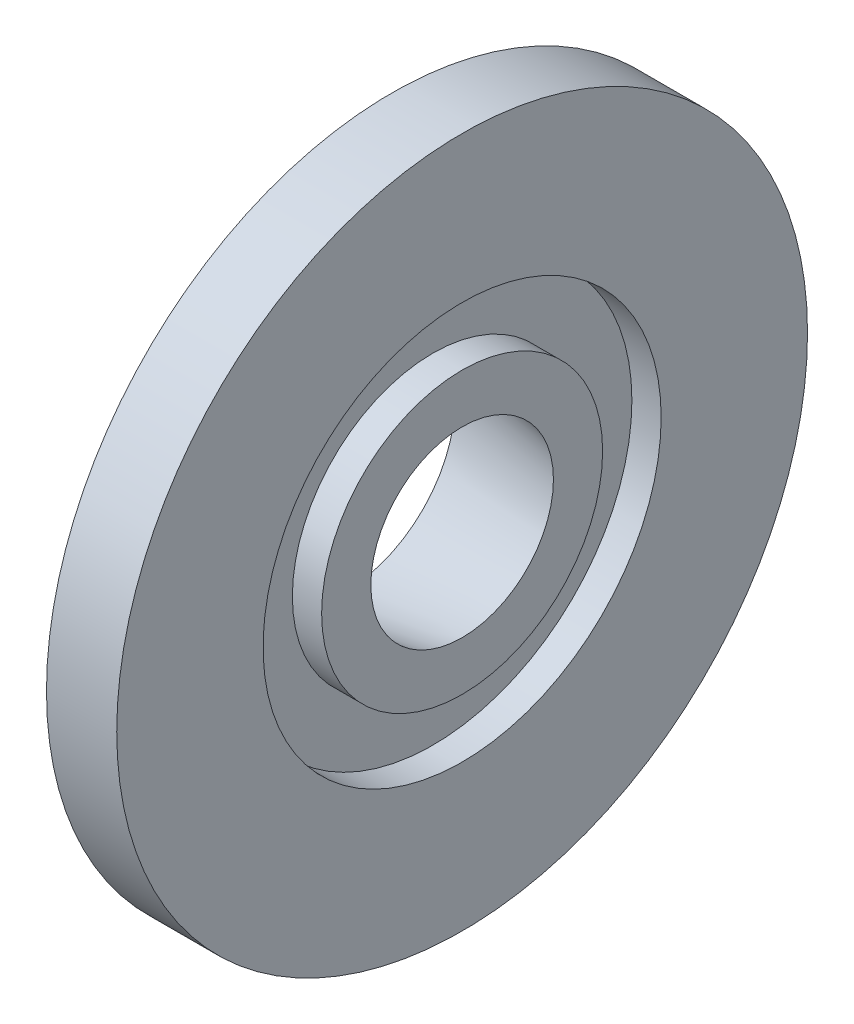
ISO-10303-21;
HEADER;
FILE_DESCRIPTION(('STEP AP214'),'2;1');
FILE_NAME('part.step','',(''),(''),'','','');
FILE_SCHEMA(('AUTOMOTIVE_DESIGN { 1 0 10303 214 1 1 1 1 }'));
ENDSEC;
DATA;
#1=APPLICATION_CONTEXT('core data for automotive mechanical design processes');
#2=APPLICATION_PROTOCOL_DEFINITION('international standard','automotive_design',2000,#1);
#3=PRODUCT_CONTEXT('',#1,'mechanical');
#4=PRODUCT('Part','Part','',(#3));
#5=PRODUCT_RELATED_PRODUCT_CATEGORY('part','',(#4));
#6=PRODUCT_DEFINITION_FORMATION('','',#4);
#7=PRODUCT_DEFINITION_CONTEXT('part definition',#1,'design');
#8=PRODUCT_DEFINITION('design','',#6,#7);
#9=PRODUCT_DEFINITION_SHAPE('','',#8);
#10=(LENGTH_UNIT() NAMED_UNIT(*) SI_UNIT(.MILLI.,.METRE.));
#11=(NAMED_UNIT(*) PLANE_ANGLE_UNIT() SI_UNIT($,.RADIAN.));
#12=(NAMED_UNIT(*) SI_UNIT($,.STERADIAN.) SOLID_ANGLE_UNIT());
#13=UNCERTAINTY_MEASURE_WITH_UNIT(LENGTH_MEASURE(1.E-05),#10,'distance_accuracy_value','');
#14=(GEOMETRIC_REPRESENTATION_CONTEXT(3) GLOBAL_UNCERTAINTY_ASSIGNED_CONTEXT((#13)) GLOBAL_UNIT_ASSIGNED_CONTEXT((#10,
#11,#12)) REPRESENTATION_CONTEXT('',''));
#15=CARTESIAN_POINT('',(0.,0.,0.));
#16=DIRECTION('',(0.,0.,1.));
#17=DIRECTION('',(1.,0.,0.));
#18=AXIS2_PLACEMENT_3D('',#15,#16,#17);
#19=CARTESIAN_POINT('',(-12.5127640067433,0.,0.));
#20=DIRECTION('',(1.,0.,0.));
#21=DIRECTION('',(0.,0.,-1.));
#22=AXIS2_PLACEMENT_3D('',#19,#20,#21);
#23=CYLINDRICAL_SURFACE('',#22,8.636);
#24=CARTESIAN_POINT('',(-2.54,0.,0.));
#25=DIRECTION('',(1.,0.,0.));
#26=DIRECTION('',(0.,0.,-1.));
#27=AXIS2_PLACEMENT_3D('',#24,#25,#26);
#28=CIRCLE('',#27,8.636);
#29=CARTESIAN_POINT('',(-2.54,0.,-8.636));
#30=VERTEX_POINT('',#29);
#31=EDGE_CURVE('E10',#30,#30,#28,.T.);
#32=ORIENTED_EDGE('',*,*,#31,.T.);
#33=EDGE_LOOP('',(#32));
#34=FACE_BOUND('',#33,.T.);
#35=CARTESIAN_POINT('',(-3.81,0.,0.));
#36=DIRECTION('',(1.,0.,0.));
#37=DIRECTION('',(0.,0.,-1.));
#38=AXIS2_PLACEMENT_3D('',#35,#36,#37);
#39=CIRCLE('',#38,8.636);
#40=CARTESIAN_POINT('',(-3.81,0.,-8.636));
#41=VERTEX_POINT('',#40);
#42=EDGE_CURVE('E56',#41,#41,#39,.T.);
#43=ORIENTED_EDGE('',*,*,#42,.F.);
#44=EDGE_LOOP('',(#43));
#45=FACE_BOUND('',#44,.T.);
#46=ADVANCED_FACE('F31',(#34,#45),#23,.F.);
#47=CARTESIAN_POINT('',(-2.54,8.636,0.));
#48=DIRECTION('',(1.,0.,0.));
#49=DIRECTION('',(0.,0.,-1.));
#50=AXIS2_PLACEMENT_3D('',#47,#48,#49);
#51=PLANE('',#50);
#52=CARTESIAN_POINT('',(-2.54,0.,0.));
#53=DIRECTION('',(1.,0.,0.));
#54=DIRECTION('',(0.,0.,-1.));
#55=AXIS2_PLACEMENT_3D('',#52,#53,#54);
#56=CIRCLE('',#55,14.986);
#57=CARTESIAN_POINT('',(-2.54,0.,-14.986));
#58=VERTEX_POINT('',#57);
#59=EDGE_CURVE('E38',#58,#58,#56,.T.);
#60=ORIENTED_EDGE('',*,*,#59,.T.);
#61=EDGE_LOOP('',(#60));
#62=FACE_BOUND('',#61,.T.);
#63=ORIENTED_EDGE('',*,*,#31,.F.);
#64=EDGE_LOOP('',(#63));
#65=FACE_BOUND('',#64,.T.);
#66=ADVANCED_FACE('F86',(#62,#65),#51,.T.);
#67=CARTESIAN_POINT('',(-12.5127640067433,0.,0.));
#68=DIRECTION('',(1.,0.,0.));
#69=DIRECTION('',(0.,0.,-1.));
#70=AXIS2_PLACEMENT_3D('',#67,#68,#69);
#71=CYLINDRICAL_SURFACE('',#70,14.986);
#72=CARTESIAN_POINT('',(-5.588,0.,0.));
#73=DIRECTION('',(1.,0.,0.));
#74=DIRECTION('',(0.,0.,-1.));
#75=AXIS2_PLACEMENT_3D('',#72,#73,#74);
#76=CIRCLE('',#75,14.986);
#77=CARTESIAN_POINT('',(-5.588,0.,-14.986));
#78=VERTEX_POINT('',#77);
#79=EDGE_CURVE('E42',#78,#78,#76,.T.);
#80=ORIENTED_EDGE('',*,*,#79,.T.);
#81=EDGE_LOOP('',(#80));
#82=FACE_BOUND('',#81,.T.);
#83=ORIENTED_EDGE('',*,*,#59,.F.);
#84=EDGE_LOOP('',(#83));
#85=FACE_BOUND('',#84,.T.);
#86=ADVANCED_FACE('F90',(#82,#85),#71,.T.);
#87=CARTESIAN_POINT('',(-5.588,0.,0.));
#88=DIRECTION('',(1.,0.,0.));
#89=DIRECTION('',(0.,0.,-1.));
#90=AXIS2_PLACEMENT_3D('',#87,#88,#89);
#91=CONICAL_SURFACE('',#90,14.986,1.30899693899575);
#92=CARTESIAN_POINT('',(-7.62,0.,0.));
#93=DIRECTION('',(1.,0.,0.));
#94=DIRECTION('',(0.,0.,-1.));
#95=AXIS2_PLACEMENT_3D('',#92,#93,#94);
#96=CIRCLE('',#95,7.40247275901983);
#97=CARTESIAN_POINT('',(-7.62,0.,-7.40247275901983));
#98=VERTEX_POINT('',#97);
#99=EDGE_CURVE('E47',#98,#98,#96,.T.);
#100=ORIENTED_EDGE('',*,*,#99,.T.);
#101=EDGE_LOOP('',(#100));
#102=FACE_BOUND('',#101,.T.);
#103=ORIENTED_EDGE('',*,*,#79,.F.);
#104=EDGE_LOOP('',(#103));
#105=FACE_BOUND('',#104,.T.);
#106=ADVANCED_FACE('F99',(#102,#105),#91,.T.);
#107=CARTESIAN_POINT('',(-7.62,7.40247275901983,0.));
#108=DIRECTION('',(-1.,0.,0.));
#109=DIRECTION('',(0.,0.,1.));
#110=AXIS2_PLACEMENT_3D('',#107,#108,#109);
#111=PLANE('',#110);
#112=CARTESIAN_POINT('',(-7.62,0.,0.));
#113=DIRECTION('',(-1.,0.,0.));
#114=DIRECTION('',(0.,0.,1.));
#115=AXIS2_PLACEMENT_3D('',#112,#113,#114);
#116=CIRCLE('',#115,4.77408803214677);
#117=CARTESIAN_POINT('',(-7.62,0.,4.77408803214677));
#118=VERTEX_POINT('',#117);
#119=EDGE_CURVE('E59',#118,#118,#116,.T.);
#120=ORIENTED_EDGE('',*,*,#119,.F.);
#121=EDGE_LOOP('',(#120));
#122=FACE_BOUND('',#121,.T.);
#123=ORIENTED_EDGE('',*,*,#99,.F.);
#124=EDGE_LOOP('',(#123));
#125=FACE_BOUND('',#124,.T.);
#126=ADVANCED_FACE('F72',(#122,#125),#111,.T.);
#127=CARTESIAN_POINT('',(-2.54,6.096,0.));
#128=DIRECTION('',(1.,0.,0.));
#129=DIRECTION('',(0.,0.,-1.));
#130=AXIS2_PLACEMENT_3D('',#127,#128,#129);
#131=PLANE('',#130);
#132=CARTESIAN_POINT('',(-2.54,0.,0.));
#133=DIRECTION('',(1.,0.,0.));
#134=DIRECTION('',(0.,0.,-1.));
#135=AXIS2_PLACEMENT_3D('',#132,#133,#134);
#136=CIRCLE('',#135,3.96150688025417);
#137=CARTESIAN_POINT('',(-2.54,0.,-3.96150688025417));
#138=VERTEX_POINT('',#137);
#139=EDGE_CURVE('E34',#138,#138,#136,.T.);
#140=ORIENTED_EDGE('',*,*,#139,.F.);
#141=EDGE_LOOP('',(#140));
#142=FACE_BOUND('',#141,.T.);
#143=CARTESIAN_POINT('',(-2.54,0.,0.));
#144=DIRECTION('',(1.,0.,0.));
#145=DIRECTION('',(0.,0.,-1.));
#146=AXIS2_PLACEMENT_3D('',#143,#144,#145);
#147=CIRCLE('',#146,6.096);
#148=CARTESIAN_POINT('',(-2.54,0.,-6.096));
#149=VERTEX_POINT('',#148);
#150=EDGE_CURVE('E50',#149,#149,#147,.T.);
#151=ORIENTED_EDGE('',*,*,#150,.T.);
#152=EDGE_LOOP('',(#151));
#153=FACE_BOUND('',#152,.T.);
#154=ADVANCED_FACE('F68',(#142,#153),#131,.T.);
#155=CARTESIAN_POINT('',(-12.5127640067433,0.,0.));
#156=DIRECTION('',(1.,0.,0.));
#157=DIRECTION('',(0.,0.,-1.));
#158=AXIS2_PLACEMENT_3D('',#155,#156,#157);
#159=CYLINDRICAL_SURFACE('',#158,6.096);
#160=CARTESIAN_POINT('',(-3.81,0.,0.));
#161=DIRECTION('',(1.,0.,0.));
#162=DIRECTION('',(0.,0.,-1.));
#163=AXIS2_PLACEMENT_3D('',#160,#161,#162);
#164=CIRCLE('',#163,6.096);
#165=CARTESIAN_POINT('',(-3.81,0.,-6.096));
#166=VERTEX_POINT('',#165);
#167=EDGE_CURVE('E53',#166,#166,#164,.T.);
#168=ORIENTED_EDGE('',*,*,#167,.T.);
#169=EDGE_LOOP('',(#168));
#170=FACE_BOUND('',#169,.T.);
#171=ORIENTED_EDGE('',*,*,#150,.F.);
#172=EDGE_LOOP('',(#171));
#173=FACE_BOUND('',#172,.T.);
#174=ADVANCED_FACE('F71',(#170,#173),#159,.T.);
#175=CARTESIAN_POINT('',(-3.81,6.096,0.));
#176=DIRECTION('',(1.,0.,0.));
#177=DIRECTION('',(0.,0.,-1.));
#178=AXIS2_PLACEMENT_3D('',#175,#176,#177);
#179=PLANE('',#178);
#180=ORIENTED_EDGE('',*,*,#42,.T.);
#181=EDGE_LOOP('',(#180));
#182=FACE_BOUND('',#181,.T.);
#183=ORIENTED_EDGE('',*,*,#167,.F.);
#184=EDGE_LOOP('',(#183));
#185=FACE_BOUND('',#184,.T.);
#186=ADVANCED_FACE('F77',(#182,#185),#179,.T.);
#187=CARTESIAN_POINT('',(0.0133900262067107,0.,0.));
#188=DIRECTION('',(-1.,0.,0.));
#189=DIRECTION('',(0.,-1.,0.));
#190=AXIS2_PLACEMENT_3D('',#187,#188,#189);
#191=CONICAL_SURFACE('',#190,3.55307447696162,0.158613256896216);
#192=ORIENTED_EDGE('',*,*,#119,.T.);
#193=EDGE_LOOP('',(#192));
#194=FACE_BOUND('',#193,.T.);
#195=ORIENTED_EDGE('',*,*,#139,.T.);
#196=EDGE_LOOP('',(#195));
#197=FACE_BOUND('',#196,.T.);
#198=ADVANCED_FACE('F66',(#194,#197),#191,.F.);
#199=CLOSED_SHELL('',(#46,#66,#86,#106,#126,#154,#174,#186,#198));
#200=MANIFOLD_SOLID_BREP('B2',#199);
#201=ADVANCED_BREP_SHAPE_REPRESENTATION('',(#18,#200),#14);
#202=SHAPE_DEFINITION_REPRESENTATION(#9,#201);
ENDSEC;
END-ISO-10303-21;
